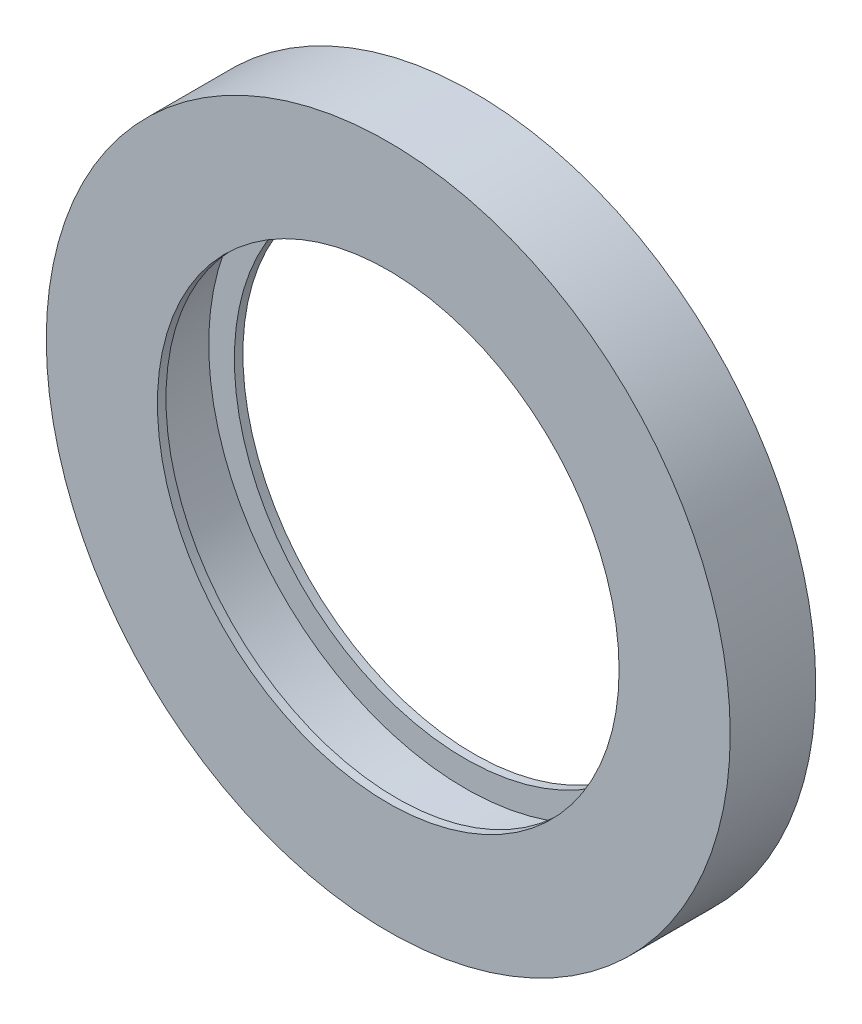
ISO-10303-21;
HEADER;
FILE_DESCRIPTION(('STEP AP214'),'2;1');
FILE_NAME('part.step','',(''),(''),'','','');
FILE_SCHEMA(('AUTOMOTIVE_DESIGN { 1 0 10303 214 1 1 1 1 }'));
ENDSEC;
DATA;
#1=APPLICATION_CONTEXT('core data for automotive mechanical design processes');
#2=APPLICATION_PROTOCOL_DEFINITION('international standard','automotive_design',2000,#1);
#3=PRODUCT_CONTEXT('',#1,'mechanical');
#4=PRODUCT('Part','Part','',(#3));
#5=PRODUCT_RELATED_PRODUCT_CATEGORY('part','',(#4));
#6=PRODUCT_DEFINITION_FORMATION('','',#4);
#7=PRODUCT_DEFINITION_CONTEXT('part definition',#1,'design');
#8=PRODUCT_DEFINITION('design','',#6,#7);
#9=PRODUCT_DEFINITION_SHAPE('','',#8);
#10=(LENGTH_UNIT() NAMED_UNIT(*) SI_UNIT(.MILLI.,.METRE.));
#11=(NAMED_UNIT(*) PLANE_ANGLE_UNIT() SI_UNIT($,.RADIAN.));
#12=(NAMED_UNIT(*) SI_UNIT($,.STERADIAN.) SOLID_ANGLE_UNIT());
#13=UNCERTAINTY_MEASURE_WITH_UNIT(LENGTH_MEASURE(1.E-05),#10,'distance_accuracy_value','');
#14=(GEOMETRIC_REPRESENTATION_CONTEXT(3) GLOBAL_UNCERTAINTY_ASSIGNED_CONTEXT((#13)) GLOBAL_UNIT_ASSIGNED_CONTEXT((#10,
#11,#12)) REPRESENTATION_CONTEXT('',''));
#15=CARTESIAN_POINT('',(0.,0.,0.));
#16=DIRECTION('',(0.,0.,1.));
#17=DIRECTION('',(1.,0.,0.));
#18=AXIS2_PLACEMENT_3D('',#15,#16,#17);
#19=CARTESIAN_POINT('',(0.,0.,10.));
#20=DIRECTION('',(0.,0.,-1.));
#21=DIRECTION('',(-1.,0.,0.));
#22=AXIS2_PLACEMENT_3D('',#19,#20,#21);
#23=CYLINDRICAL_SURFACE('',#22,30.);
#24=CARTESIAN_POINT('',(0.,0.,1.));
#25=DIRECTION('',(0.,0.,1.));
#26=DIRECTION('',(1.,0.,0.));
#27=AXIS2_PLACEMENT_3D('',#24,#25,#26);
#28=CIRCLE('',#27,30.);
#29=CARTESIAN_POINT('',(30.,0.,1.));
#30=VERTEX_POINT('',#29);
#31=EDGE_CURVE('E10',#30,#30,#28,.T.);
#32=ORIENTED_EDGE('',*,*,#31,.F.);
#33=EDGE_LOOP('',(#32));
#34=FACE_BOUND('',#33,.T.);
#35=CARTESIAN_POINT('',(0.,0.,9.));
#36=DIRECTION('',(0.,0.,1.));
#37=DIRECTION('',(1.,0.,0.));
#38=AXIS2_PLACEMENT_3D('',#35,#36,#37);
#39=CIRCLE('',#38,30.);
#40=CARTESIAN_POINT('',(30.,0.,9.));
#41=VERTEX_POINT('',#40);
#42=EDGE_CURVE('E53',#41,#41,#39,.T.);
#43=ORIENTED_EDGE('',*,*,#42,.T.);
#44=EDGE_LOOP('',(#43));
#45=FACE_BOUND('',#44,.T.);
#46=ADVANCED_FACE('F37',(#34,#45),#23,.F.);
#47=CARTESIAN_POINT('',(0.,0.,10.));
#48=DIRECTION('',(0.,0.,1.));
#49=DIRECTION('',(1.,0.,0.));
#50=AXIS2_PLACEMENT_3D('',#47,#48,#49);
#51=PLANE('',#50);
#52=CARTESIAN_POINT('',(0.,0.,10.));
#53=DIRECTION('',(0.,0.,1.));
#54=DIRECTION('',(1.,0.,0.));
#55=AXIS2_PLACEMENT_3D('',#52,#53,#54);
#56=CIRCLE('',#55,40.);
#57=CARTESIAN_POINT('',(40.,0.,10.));
#58=VERTEX_POINT('',#57);
#59=EDGE_CURVE('E44',#58,#58,#56,.T.);
#60=ORIENTED_EDGE('',*,*,#59,.T.);
#61=EDGE_LOOP('',(#60));
#62=FACE_BOUND('',#61,.T.);
#63=CARTESIAN_POINT('',(0.,0.,10.));
#64=DIRECTION('',(0.,0.,1.));
#65=DIRECTION('',(1.,0.,0.));
#66=AXIS2_PLACEMENT_3D('',#63,#64,#65);
#67=CIRCLE('',#66,27.);
#68=CARTESIAN_POINT('',(27.,0.,10.));
#69=VERTEX_POINT('',#68);
#70=EDGE_CURVE('E58',#69,#69,#67,.T.);
#71=ORIENTED_EDGE('',*,*,#70,.F.);
#72=EDGE_LOOP('',(#71));
#73=FACE_BOUND('',#72,.T.);
#74=ADVANCED_FACE('F90',(#62,#73),#51,.T.);
#75=CARTESIAN_POINT('',(0.,0.,0.));
#76=DIRECTION('',(0.,0.,1.));
#77=DIRECTION('',(1.,0.,0.));
#78=AXIS2_PLACEMENT_3D('',#75,#76,#77);
#79=PLANE('',#78);
#80=CARTESIAN_POINT('',(0.,0.,0.));
#81=DIRECTION('',(0.,0.,1.));
#82=DIRECTION('',(1.,0.,0.));
#83=AXIS2_PLACEMENT_3D('',#80,#81,#82);
#84=CIRCLE('',#83,40.);
#85=CARTESIAN_POINT('',(40.,0.,0.));
#86=VERTEX_POINT('',#85);
#87=EDGE_CURVE('E48',#86,#86,#84,.T.);
#88=ORIENTED_EDGE('',*,*,#87,.F.);
#89=EDGE_LOOP('',(#88));
#90=FACE_BOUND('',#89,.T.);
#91=CARTESIAN_POINT('',(0.,0.,0.));
#92=DIRECTION('',(0.,0.,1.));
#93=DIRECTION('',(1.,0.,0.));
#94=AXIS2_PLACEMENT_3D('',#91,#92,#93);
#95=CIRCLE('',#94,27.);
#96=CARTESIAN_POINT('',(27.,0.,0.));
#97=VERTEX_POINT('',#96);
#98=EDGE_CURVE('E61',#97,#97,#95,.T.);
#99=ORIENTED_EDGE('',*,*,#98,.T.);
#100=EDGE_LOOP('',(#99));
#101=FACE_BOUND('',#100,.T.);
#102=ADVANCED_FACE('F70',(#90,#101),#79,.F.);
#103=CARTESIAN_POINT('',(0.,0.,10.));
#104=DIRECTION('',(0.,0.,-1.));
#105=DIRECTION('',(-1.,0.,0.));
#106=AXIS2_PLACEMENT_3D('',#103,#104,#105);
#107=CYLINDRICAL_SURFACE('',#106,40.);
#108=ORIENTED_EDGE('',*,*,#59,.F.);
#109=EDGE_LOOP('',(#108));
#110=FACE_BOUND('',#109,.T.);
#111=ORIENTED_EDGE('',*,*,#87,.T.);
#112=EDGE_LOOP('',(#111));
#113=FACE_BOUND('',#112,.T.);
#114=ADVANCED_FACE('F39',(#110,#113),#107,.T.);
#115=CARTESIAN_POINT('',(0.,0.,9.));
#116=DIRECTION('',(0.,0.,1.));
#117=DIRECTION('',(1.,0.,0.));
#118=AXIS2_PLACEMENT_3D('',#115,#116,#117);
#119=PLANE('',#118);
#120=CARTESIAN_POINT('',(0.,0.,9.));
#121=DIRECTION('',(0.,0.,1.));
#122=DIRECTION('',(1.,0.,0.));
#123=AXIS2_PLACEMENT_3D('',#120,#121,#122);
#124=CIRCLE('',#123,27.);
#125=CARTESIAN_POINT('',(27.,0.,9.));
#126=VERTEX_POINT('',#125);
#127=EDGE_CURVE('E57',#126,#126,#124,.T.);
#128=ORIENTED_EDGE('',*,*,#127,.T.);
#129=EDGE_LOOP('',(#128));
#130=FACE_BOUND('',#129,.T.);
#131=ORIENTED_EDGE('',*,*,#42,.F.);
#132=EDGE_LOOP('',(#131));
#133=FACE_BOUND('',#132,.T.);
#134=ADVANCED_FACE('F86',(#130,#133),#119,.F.);
#135=CARTESIAN_POINT('',(0.,0.,9.));
#136=DIRECTION('',(0.,0.,1.));
#137=DIRECTION('',(1.,0.,0.));
#138=AXIS2_PLACEMENT_3D('',#135,#136,#137);
#139=CYLINDRICAL_SURFACE('',#138,27.);
#140=ORIENTED_EDGE('',*,*,#127,.F.);
#141=EDGE_LOOP('',(#140));
#142=FACE_BOUND('',#141,.T.);
#143=ORIENTED_EDGE('',*,*,#70,.T.);
#144=EDGE_LOOP('',(#143));
#145=FACE_BOUND('',#144,.T.);
#146=ADVANCED_FACE('F80',(#142,#145),#139,.F.);
#147=CARTESIAN_POINT('',(0.,0.,1.));
#148=DIRECTION('',(0.,0.,1.));
#149=DIRECTION('',(1.,0.,0.));
#150=AXIS2_PLACEMENT_3D('',#147,#148,#149);
#151=PLANE('',#150);
#152=CARTESIAN_POINT('',(0.,0.,1.));
#153=DIRECTION('',(0.,0.,1.));
#154=DIRECTION('',(1.,0.,0.));
#155=AXIS2_PLACEMENT_3D('',#152,#153,#154);
#156=CIRCLE('',#155,27.);
#157=CARTESIAN_POINT('',(27.,0.,1.));
#158=VERTEX_POINT('',#157);
#159=EDGE_CURVE('E64',#158,#158,#156,.T.);
#160=ORIENTED_EDGE('',*,*,#159,.F.);
#161=EDGE_LOOP('',(#160));
#162=FACE_BOUND('',#161,.T.);
#163=ORIENTED_EDGE('',*,*,#31,.T.);
#164=EDGE_LOOP('',(#163));
#165=FACE_BOUND('',#164,.T.);
#166=ADVANCED_FACE('F75',(#162,#165),#151,.T.);
#167=CARTESIAN_POINT('',(0.,0.,0.));
#168=DIRECTION('',(0.,0.,1.));
#169=DIRECTION('',(1.,0.,0.));
#170=AXIS2_PLACEMENT_3D('',#167,#168,#169);
#171=CYLINDRICAL_SURFACE('',#170,27.);
#172=ORIENTED_EDGE('',*,*,#98,.F.);
#173=EDGE_LOOP('',(#172));
#174=FACE_BOUND('',#173,.T.);
#175=ORIENTED_EDGE('',*,*,#159,.T.);
#176=EDGE_LOOP('',(#175));
#177=FACE_BOUND('',#176,.T.);
#178=ADVANCED_FACE('F72',(#174,#177),#171,.F.);
#179=CLOSED_SHELL('',(#46,#74,#102,#114,#134,#146,#166,#178));
#180=MANIFOLD_SOLID_BREP('B2',#179);
#181=ADVANCED_BREP_SHAPE_REPRESENTATION('',(#18,#180),#14);
#182=SHAPE_DEFINITION_REPRESENTATION(#9,#181);
ENDSEC;
END-ISO-10303-21;
